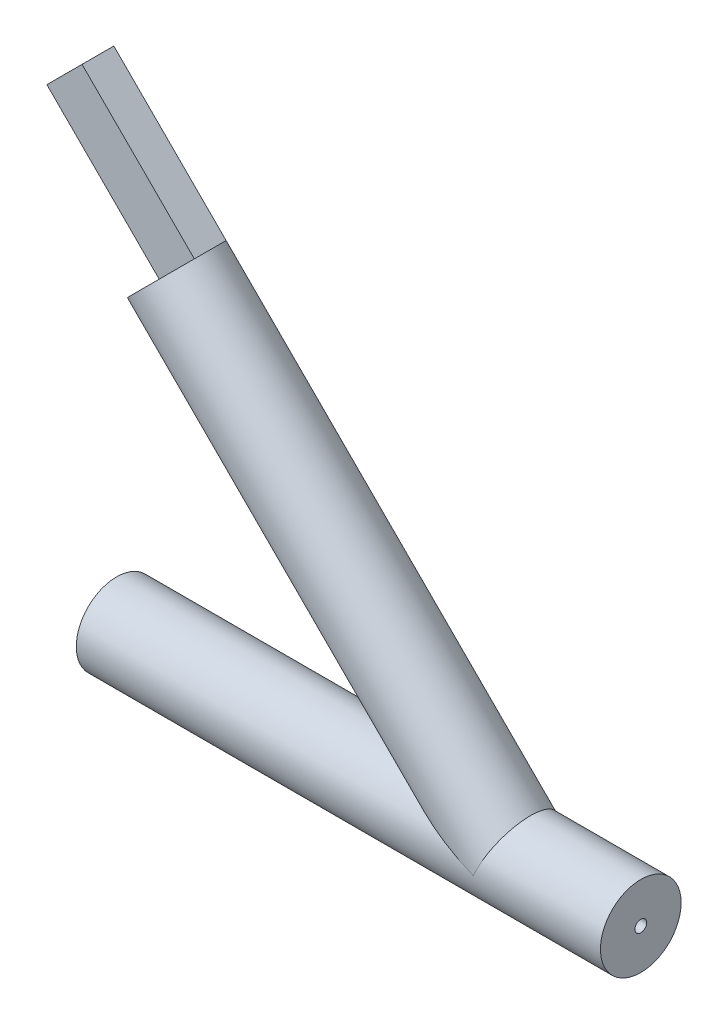
ISO-10303-21;
HEADER;
FILE_DESCRIPTION(('STEP AP214'),'2;1');
FILE_NAME('part.step','',(''),(''),'','','');
FILE_SCHEMA(('AUTOMOTIVE_DESIGN { 1 0 10303 214 1 1 1 1 }'));
ENDSEC;
DATA;
#1=APPLICATION_CONTEXT('core data for automotive mechanical design processes');
#2=APPLICATION_PROTOCOL_DEFINITION('international standard','automotive_design',2000,#1);
#3=PRODUCT_CONTEXT('',#1,'mechanical');
#4=PRODUCT('Part','Part','',(#3));
#5=PRODUCT_RELATED_PRODUCT_CATEGORY('part','',(#4));
#6=PRODUCT_DEFINITION_FORMATION('','',#4);
#7=PRODUCT_DEFINITION_CONTEXT('part definition',#1,'design');
#8=PRODUCT_DEFINITION('design','',#6,#7);
#9=PRODUCT_DEFINITION_SHAPE('','',#8);
#10=(LENGTH_UNIT() NAMED_UNIT(*) SI_UNIT(.MILLI.,.METRE.));
#11=(NAMED_UNIT(*) PLANE_ANGLE_UNIT() SI_UNIT($,.RADIAN.));
#12=(NAMED_UNIT(*) SI_UNIT($,.STERADIAN.) SOLID_ANGLE_UNIT());
#13=UNCERTAINTY_MEASURE_WITH_UNIT(LENGTH_MEASURE(1.E-05),#10,'distance_accuracy_value','');
#14=(GEOMETRIC_REPRESENTATION_CONTEXT(3) GLOBAL_UNCERTAINTY_ASSIGNED_CONTEXT((#13)) GLOBAL_UNIT_ASSIGNED_CONTEXT((#10,
#11,#12)) REPRESENTATION_CONTEXT('',''));
#15=CARTESIAN_POINT('',(0.,0.,0.));
#16=DIRECTION('',(0.,0.,1.));
#17=DIRECTION('',(1.,0.,0.));
#18=AXIS2_PLACEMENT_3D('',#15,#16,#17);
#19=CARTESIAN_POINT('',(18.9339828220177,106.066017177982,0.));
#20=DIRECTION('',(-0.707106781186549,0.707106781186546,0.));
#21=DIRECTION('',(-0.707106781186546,-0.707106781186549,0.));
#22=AXIS2_PLACEMENT_3D('',#19,#20,#21);
#23=PLANE('',#22);
#24=DIRECTION('',(0.,0.,1.));
#25=VECTOR('',#24,1.);
#26=CARTESIAN_POINT('',(24.4697754481915,111.601809804156,0.));
#27=LINE('',#26,#25);
#28=CARTESIAN_POINT('',(24.4697754481915,111.601809804156,-10.));
#29=VERTEX_POINT('',#28);
#30=CARTESIAN_POINT('',(24.4697754481915,111.601809804156,0.));
#31=VERTEX_POINT('',#30);
#32=EDGE_CURVE('E109',#29,#31,#27,.T.);
#33=ORIENTED_EDGE('',*,*,#32,.T.);
#34=DIRECTION('',(-0.707106781186546,-0.707106781186549,0.));
#35=VECTOR('',#34,1.);
#36=CARTESIAN_POINT('',(-43.5660171779821,43.566017177982,0.));
#37=LINE('',#36,#35);
#38=CARTESIAN_POINT('',(13.3981901958439,100.530224551808,0.));
#39=VERTEX_POINT('',#38);
#40=EDGE_CURVE('E51',#31,#39,#37,.T.);
#41=ORIENTED_EDGE('',*,*,#40,.T.);
#42=DIRECTION('',(0.,0.,1.));
#43=VECTOR('',#42,1.);
#44=CARTESIAN_POINT('',(13.3981901958439,100.530224551808,0.));
#45=LINE('',#44,#43);
#46=CARTESIAN_POINT('',(13.3981901958439,100.530224551808,-10.));
#47=VERTEX_POINT('',#46);
#48=EDGE_CURVE('E97',#47,#39,#45,.T.);
#49=ORIENTED_EDGE('',*,*,#48,.F.);
#50=CARTESIAN_POINT('',(18.9339828220177,106.066017177982,0.));
#51=DIRECTION('',(-0.707106781186549,0.707106781186546,0.));
#52=DIRECTION('',(-0.707106781186546,-0.707106781186549,0.));
#53=AXIS2_PLACEMENT_3D('',#50,#51,#52);
#54=CIRCLE('',#53,12.7);
#55=EDGE_CURVE('E87',#47,#29,#54,.T.);
#56=ORIENTED_EDGE('',*,*,#55,.T.);
#57=EDGE_LOOP('',(#33,#41,#49,#56));
#58=FACE_BOUND('',#57,.T.);
#59=ADVANCED_FACE('F35',(#58),#23,.T.);
#60=CARTESIAN_POINT('',(165.,0.,0.));
#61=DIRECTION('',(-1.,0.,0.));
#62=DIRECTION('',(0.,0.,1.));
#63=AXIS2_PLACEMENT_3D('',#60,#61,#62);
#64=CYLINDRICAL_SURFACE('',#63,12.7);
#65=CARTESIAN_POINT('',(0.,0.,0.));
#66=DIRECTION('',(1.,0.,0.));
#67=DIRECTION('',(0.,0.,-1.));
#68=AXIS2_PLACEMENT_3D('',#65,#66,#67);
#69=CIRCLE('',#68,12.7);
#70=CARTESIAN_POINT('',(0.,0.,-12.7));
#71=VERTEX_POINT('',#70);
#72=EDGE_CURVE('E123',#71,#71,#69,.T.);
#73=ORIENTED_EDGE('',*,*,#72,.T.);
#74=EDGE_LOOP('',(#73));
#75=FACE_BOUND('',#74,.T.);
#76=CARTESIAN_POINT('',(165.,0.,0.));
#77=DIRECTION('',(1.,0.,0.));
#78=DIRECTION('',(0.,0.,-1.));
#79=AXIS2_PLACEMENT_3D('',#76,#77,#78);
#80=CIRCLE('',#79,12.7);
#81=CARTESIAN_POINT('',(165.,0.,-12.7));
#82=VERTEX_POINT('',#81);
#83=EDGE_CURVE('E124',#82,#82,#80,.T.);
#84=ORIENTED_EDGE('',*,*,#83,.F.);
#85=EDGE_LOOP('',(#84));
#86=FACE_BOUND('',#85,.T.);
#87=CARTESIAN_POINT('',(125.,0.,0.));
#88=DIRECTION('',(-0.382683432365089,-0.923879532511287,0.));
#89=DIRECTION('',(-0.923879532511287,0.382683432365089,0.));
#90=AXIS2_PLACEMENT_3D('',#87,#88,#89);
#91=ELLIPSE('',#90,33.1866993078601,12.7);
#92=CARTESIAN_POINT('',(125.,0.,-12.7));
#93=VERTEX_POINT('',#92);
#94=CARTESIAN_POINT('',(125.,0.,12.7));
#95=VERTEX_POINT('',#94);
#96=EDGE_CURVE('E11',#93,#95,#91,.F.);
#97=ORIENTED_EDGE('',*,*,#96,.F.);
#98=CARTESIAN_POINT('',(125.,0.,0.));
#99=DIRECTION('',(-0.923879532511287,0.382683432365089,0.));
#100=DIRECTION('',(-0.382683432365089,-0.923879532511287,0.));
#101=AXIS2_PLACEMENT_3D('',#98,#99,#100);
#102=ELLIPSE('',#101,13.7463809437134,12.7);
#103=EDGE_CURVE('E44',#95,#93,#102,.T.);
#104=ORIENTED_EDGE('',*,*,#103,.F.);
#105=EDGE_LOOP('',(#97,#104));
#106=FACE_BOUND('',#105,.T.);
#107=ADVANCED_FACE('F37',(#75,#86,#106),#64,.T.);
#108=CARTESIAN_POINT('',(165.,0.,0.));
#109=DIRECTION('',(1.,0.,0.));
#110=DIRECTION('',(0.,0.,-1.));
#111=AXIS2_PLACEMENT_3D('',#108,#109,#110);
#112=PLANE('',#111);
#113=CARTESIAN_POINT('',(165.,0.,0.));
#114=DIRECTION('',(1.,0.,0.));
#115=DIRECTION('',(0.,0.,-1.));
#116=AXIS2_PLACEMENT_3D('',#113,#114,#115);
#117=CIRCLE('',#116,1.85);
#118=CARTESIAN_POINT('',(165.,0.,-1.85));
#119=VERTEX_POINT('',#118);
#120=EDGE_CURVE('E182',#119,#119,#117,.T.);
#121=ORIENTED_EDGE('',*,*,#120,.F.);
#122=EDGE_LOOP('',(#121));
#123=FACE_BOUND('',#122,.T.);
#124=ORIENTED_EDGE('',*,*,#83,.T.);
#125=EDGE_LOOP('',(#124));
#126=FACE_BOUND('',#125,.T.);
#127=ADVANCED_FACE('F132',(#123,#126),#112,.T.);
#128=CARTESIAN_POINT('',(0.,0.,0.));
#129=DIRECTION('',(1.,0.,0.));
#130=DIRECTION('',(0.,0.,-1.));
#131=AXIS2_PLACEMENT_3D('',#128,#129,#130);
#132=PLANE('',#131);
#133=CARTESIAN_POINT('',(0.,0.,0.));
#134=DIRECTION('',(1.,0.,0.));
#135=DIRECTION('',(0.,0.,-1.));
#136=AXIS2_PLACEMENT_3D('',#133,#134,#135);
#137=CIRCLE('',#136,1.85);
#138=CARTESIAN_POINT('',(0.,0.,-1.85));
#139=VERTEX_POINT('',#138);
#140=EDGE_CURVE('E39',#139,#139,#137,.T.);
#141=ORIENTED_EDGE('',*,*,#140,.T.);
#142=EDGE_LOOP('',(#141));
#143=FACE_BOUND('',#142,.T.);
#144=ORIENTED_EDGE('',*,*,#72,.F.);
#145=EDGE_LOOP('',(#144));
#146=FACE_BOUND('',#145,.T.);
#147=ADVANCED_FACE('F138',(#143,#146),#132,.F.);
#148=CARTESIAN_POINT('',(18.9339828220177,106.066017177982,0.));
#149=DIRECTION('',(0.707106781186549,-0.707106781186546,0.));
#150=DIRECTION('',(0.707106781186546,0.707106781186549,0.));
#151=AXIS2_PLACEMENT_3D('',#148,#149,#150);
#152=CYLINDRICAL_SURFACE('',#151,12.7);
#153=EDGE_CURVE('E120',#29,#47,#54,.T.);
#154=ORIENTED_EDGE('',*,*,#153,.F.);
#155=ORIENTED_EDGE('',*,*,#55,.F.);
#156=EDGE_LOOP('',(#154,#155));
#157=FACE_BOUND('',#156,.T.);
#158=ORIENTED_EDGE('',*,*,#103,.T.);
#159=ORIENTED_EDGE('',*,*,#96,.T.);
#160=EDGE_LOOP('',(#158,#159));
#161=FACE_BOUND('',#160,.T.);
#162=ADVANCED_FACE('F130',(#157,#161),#152,.T.);
#163=DIRECTION('',(-0.707106781186546,-0.707106781186549,0.));
#164=VECTOR('',#163,1.);
#165=CARTESIAN_POINT('',(-43.5660171779821,43.566017177982,-10.));
#166=LINE('',#165,#164);
#167=EDGE_CURVE('E111',#29,#47,#166,.T.);
#168=ORIENTED_EDGE('',*,*,#167,.F.);
#169=ORIENTED_EDGE('',*,*,#153,.T.);
#170=EDGE_LOOP('',(#168,#169));
#171=FACE_BOUND('',#170,.T.);
#172=ADVANCED_FACE('F143',(#171),#23,.T.);
#173=CARTESIAN_POINT('',(-78.9213562373095,78.9213562373093,0.));
#174=DIRECTION('',(0.,0.,1.));
#175=DIRECTION('',(0.,-1.,0.));
#176=AXIS2_PLACEMENT_3D('',#173,#174,#175);
#177=PLANE('',#176);
#178=ORIENTED_EDGE('',*,*,#40,.F.);
#179=DIRECTION('',(0.707106781186549,-0.707106781186546,0.));
#180=VECTOR('',#179,1.);
#181=CARTESIAN_POINT('',(-10.885563611136,146.957148863483,0.));
#182=LINE('',#181,#180);
#183=CARTESIAN_POINT('',(-10.885563611136,146.957148863483,0.));
#184=VERTEX_POINT('',#183);
#185=EDGE_CURVE('E79',#184,#31,#182,.T.);
#186=ORIENTED_EDGE('',*,*,#185,.F.);
#187=DIRECTION('',(-0.707106781186546,-0.707106781186549,0.));
#188=VECTOR('',#187,1.);
#189=CARTESIAN_POINT('',(-78.9213562373095,78.9213562373093,0.));
#190=LINE('',#189,#188);
#191=CARTESIAN_POINT('',(-21.9571488634835,135.885563611136,0.));
#192=VERTEX_POINT('',#191);
#193=EDGE_CURVE('E82',#184,#192,#190,.T.);
#194=ORIENTED_EDGE('',*,*,#193,.T.);
#195=DIRECTION('',(0.707106781186549,-0.707106781186546,0.));
#196=VECTOR('',#195,1.);
#197=CARTESIAN_POINT('',(-21.9571488634835,135.885563611136,0.));
#198=LINE('',#197,#196);
#199=EDGE_CURVE('E107',#192,#39,#198,.T.);
#200=ORIENTED_EDGE('',*,*,#199,.T.);
#201=EDGE_LOOP('',(#178,#186,#194,#200));
#202=FACE_BOUND('',#201,.T.);
#203=ADVANCED_FACE('F81',(#202),#177,.T.);
#204=CARTESIAN_POINT('',(-10.885563611136,146.957148863483,0.));
#205=DIRECTION('',(0.707106781186546,0.707106781186549,0.));
#206=DIRECTION('',(-0.707106781186549,0.707106781186546,0.));
#207=AXIS2_PLACEMENT_3D('',#204,#205,#206);
#208=PLANE('',#207);
#209=ORIENTED_EDGE('',*,*,#32,.F.);
#210=DIRECTION('',(0.707106781186549,-0.707106781186546,0.));
#211=VECTOR('',#210,1.);
#212=CARTESIAN_POINT('',(-10.885563611136,146.957148863483,-10.));
#213=LINE('',#212,#211);
#214=CARTESIAN_POINT('',(-10.885563611136,146.957148863483,-10.));
#215=VERTEX_POINT('',#214);
#216=EDGE_CURVE('E88',#215,#29,#213,.T.);
#217=ORIENTED_EDGE('',*,*,#216,.F.);
#218=DIRECTION('',(0.,0.,1.));
#219=VECTOR('',#218,1.);
#220=CARTESIAN_POINT('',(-10.885563611136,146.957148863483,0.));
#221=LINE('',#220,#219);
#222=EDGE_CURVE('E93',#215,#184,#221,.T.);
#223=ORIENTED_EDGE('',*,*,#222,.T.);
#224=ORIENTED_EDGE('',*,*,#185,.T.);
#225=EDGE_LOOP('',(#209,#217,#223,#224));
#226=FACE_BOUND('',#225,.T.);
#227=ADVANCED_FACE('F99',(#226),#208,.T.);
#228=CARTESIAN_POINT('',(-78.9213562373095,78.9213562373093,-10.));
#229=DIRECTION('',(0.,0.,1.));
#230=DIRECTION('',(1.,0.,0.));
#231=AXIS2_PLACEMENT_3D('',#228,#229,#230);
#232=PLANE('',#231);
#233=ORIENTED_EDGE('',*,*,#167,.T.);
#234=DIRECTION('',(0.707106781186549,-0.707106781186546,0.));
#235=VECTOR('',#234,1.);
#236=CARTESIAN_POINT('',(-21.9571488634835,135.885563611135,-10.));
#237=LINE('',#236,#235);
#238=CARTESIAN_POINT('',(-21.9571488634835,135.885563611135,-10.));
#239=VERTEX_POINT('',#238);
#240=EDGE_CURVE('E116',#239,#47,#237,.T.);
#241=ORIENTED_EDGE('',*,*,#240,.F.);
#242=DIRECTION('',(-0.707106781186546,-0.707106781186549,0.));
#243=VECTOR('',#242,1.);
#244=CARTESIAN_POINT('',(-78.9213562373095,78.9213562373093,-10.));
#245=LINE('',#244,#243);
#246=EDGE_CURVE('E101',#215,#239,#245,.T.);
#247=ORIENTED_EDGE('',*,*,#246,.F.);
#248=ORIENTED_EDGE('',*,*,#216,.T.);
#249=EDGE_LOOP('',(#233,#241,#247,#248));
#250=FACE_BOUND('',#249,.T.);
#251=ADVANCED_FACE('F164',(#250),#232,.F.);
#252=CARTESIAN_POINT('',(-21.9571488634835,135.885563611136,0.));
#253=DIRECTION('',(0.707106781186546,0.707106781186549,0.));
#254=DIRECTION('',(-0.707106781186549,0.707106781186546,0.));
#255=AXIS2_PLACEMENT_3D('',#252,#253,#254);
#256=PLANE('',#255);
#257=ORIENTED_EDGE('',*,*,#48,.T.);
#258=ORIENTED_EDGE('',*,*,#199,.F.);
#259=DIRECTION('',(0.,0.,1.));
#260=VECTOR('',#259,1.);
#261=CARTESIAN_POINT('',(-21.9571488634835,135.885563611136,0.));
#262=LINE('',#261,#260);
#263=EDGE_CURVE('E95',#239,#192,#262,.T.);
#264=ORIENTED_EDGE('',*,*,#263,.F.);
#265=ORIENTED_EDGE('',*,*,#240,.T.);
#266=EDGE_LOOP('',(#257,#258,#264,#265));
#267=FACE_BOUND('',#266,.T.);
#268=ADVANCED_FACE('F167',(#267),#256,.F.);
#269=CARTESIAN_POINT('',(-78.9213562373095,78.9213562373093,0.));
#270=DIRECTION('',(-0.707106781186549,0.707106781186546,0.));
#271=DIRECTION('',(-0.707106781186546,-0.707106781186549,0.));
#272=AXIS2_PLACEMENT_3D('',#269,#270,#271);
#273=PLANE('',#272);
#274=ORIENTED_EDGE('',*,*,#193,.F.);
#275=ORIENTED_EDGE('',*,*,#222,.F.);
#276=ORIENTED_EDGE('',*,*,#246,.T.);
#277=ORIENTED_EDGE('',*,*,#263,.T.);
#278=EDGE_LOOP('',(#274,#275,#276,#277));
#279=FACE_BOUND('',#278,.T.);
#280=ADVANCED_FACE('F92',(#279),#273,.T.);
#281=CARTESIAN_POINT('',(-21.9571488634835,0.,0.));
#282=DIRECTION('',(1.,0.,0.));
#283=DIRECTION('',(0.,0.,-1.));
#284=AXIS2_PLACEMENT_3D('',#281,#282,#283);
#285=CYLINDRICAL_SURFACE('',#284,1.85);
#286=ORIENTED_EDGE('',*,*,#120,.T.);
#287=EDGE_LOOP('',(#286));
#288=FACE_BOUND('',#287,.T.);
#289=ORIENTED_EDGE('',*,*,#140,.F.);
#290=EDGE_LOOP('',(#289));
#291=FACE_BOUND('',#290,.T.);
#292=ADVANCED_FACE('F174',(#288,#291),#285,.F.);
#293=CLOSED_SHELL('',(#59,#107,#127,#147,#162,#172,#203,#227,#251,#268,#280,#292));
#294=MANIFOLD_SOLID_BREP('B2',#293);
#295=ADVANCED_BREP_SHAPE_REPRESENTATION('',(#18,#294),#14);
#296=SHAPE_DEFINITION_REPRESENTATION(#9,#295);
ENDSEC;
END-ISO-10303-21;
